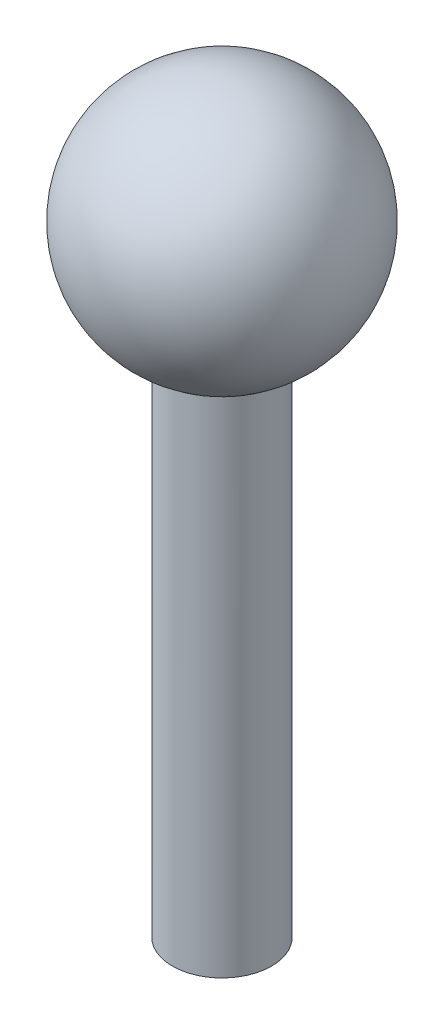
ISO-10303-21;
HEADER;
FILE_DESCRIPTION(('STEP AP214'),'2;1');
FILE_NAME('part.step','',(''),(''),'','','');
FILE_SCHEMA(('AUTOMOTIVE_DESIGN { 1 0 10303 214 1 1 1 1 }'));
ENDSEC;
DATA;
#1=APPLICATION_CONTEXT('core data for automotive mechanical design processes');
#2=APPLICATION_PROTOCOL_DEFINITION('international standard','automotive_design',2000,#1);
#3=PRODUCT_CONTEXT('',#1,'mechanical');
#4=PRODUCT('Part','Part','',(#3));
#5=PRODUCT_RELATED_PRODUCT_CATEGORY('part','',(#4));
#6=PRODUCT_DEFINITION_FORMATION('','',#4);
#7=PRODUCT_DEFINITION_CONTEXT('part definition',#1,'design');
#8=PRODUCT_DEFINITION('design','',#6,#7);
#9=PRODUCT_DEFINITION_SHAPE('','',#8);
#10=(LENGTH_UNIT() NAMED_UNIT(*) SI_UNIT(.MILLI.,.METRE.));
#11=(NAMED_UNIT(*) PLANE_ANGLE_UNIT() SI_UNIT($,.RADIAN.));
#12=(NAMED_UNIT(*) SI_UNIT($,.STERADIAN.) SOLID_ANGLE_UNIT());
#13=UNCERTAINTY_MEASURE_WITH_UNIT(LENGTH_MEASURE(1.E-05),#10,'distance_accuracy_value','');
#14=(GEOMETRIC_REPRESENTATION_CONTEXT(3) GLOBAL_UNCERTAINTY_ASSIGNED_CONTEXT((#13)) GLOBAL_UNIT_ASSIGNED_CONTEXT((#10,
#11,#12)) REPRESENTATION_CONTEXT('',''));
#15=CARTESIAN_POINT('',(0.,0.,0.));
#16=DIRECTION('',(0.,0.,1.));
#17=DIRECTION('',(1.,0.,0.));
#18=AXIS2_PLACEMENT_3D('',#15,#16,#17);
#19=CARTESIAN_POINT('',(0.,50.,0.));
#20=DIRECTION('',(0.,-1.,0.));
#21=DIRECTION('',(1.,0.,0.));
#22=AXIS2_PLACEMENT_3D('',#19,#20,#21);
#23=SPHERICAL_SURFACE('',#22,10.);
#24=CARTESIAN_POINT('',(0.,40.8348486100883,0.));
#25=DIRECTION('',(0.,-1.,0.));
#26=DIRECTION('',(0.,0.,-1.));
#27=AXIS2_PLACEMENT_3D('',#24,#25,#26);
#28=CIRCLE('',#27,4.);
#29=CARTESIAN_POINT('',(0.,40.8348486100883,-4.));
#30=VERTEX_POINT('',#29);
#31=EDGE_CURVE('E10',#30,#30,#28,.T.);
#32=ORIENTED_EDGE('',*,*,#31,.F.);
#33=EDGE_LOOP('',(#32));
#34=FACE_BOUND('',#33,.T.);
#35=ADVANCED_FACE('F45',(#34),#23,.T.);
#36=CARTESIAN_POINT('',(0.,0.,0.));
#37=DIRECTION('',(0.,-1.,0.));
#38=DIRECTION('',(0.,0.,-1.));
#39=AXIS2_PLACEMENT_3D('',#36,#37,#38);
#40=CYLINDRICAL_SURFACE('',#39,4.);
#41=CARTESIAN_POINT('',(0.,0.,0.));
#42=DIRECTION('',(0.,-1.,0.));
#43=DIRECTION('',(0.,0.,-1.));
#44=AXIS2_PLACEMENT_3D('',#41,#42,#43);
#45=CIRCLE('',#44,4.);
#46=CARTESIAN_POINT('',(0.,0.,-4.));
#47=VERTEX_POINT('',#46);
#48=EDGE_CURVE('E51',#47,#47,#45,.T.);
#49=ORIENTED_EDGE('',*,*,#48,.F.);
#50=EDGE_LOOP('',(#49));
#51=FACE_BOUND('',#50,.T.);
#52=ORIENTED_EDGE('',*,*,#31,.T.);
#53=EDGE_LOOP('',(#52));
#54=FACE_BOUND('',#53,.T.);
#55=ADVANCED_FACE('F59',(#51,#54),#40,.T.);
#56=CARTESIAN_POINT('',(0.,0.,0.));
#57=DIRECTION('',(0.,1.,0.));
#58=DIRECTION('',(0.,0.,1.));
#59=AXIS2_PLACEMENT_3D('',#56,#57,#58);
#60=PLANE('',#59);
#61=ORIENTED_EDGE('',*,*,#48,.T.);
#62=EDGE_LOOP('',(#61));
#63=FACE_BOUND('',#62,.T.);
#64=ADVANCED_FACE('F57',(#63),#60,.F.);
#65=CLOSED_SHELL('',(#35,#55,#64));
#66=MANIFOLD_SOLID_BREP('B2',#65);
#67=ADVANCED_BREP_SHAPE_REPRESENTATION('',(#18,#66),#14);
#68=SHAPE_DEFINITION_REPRESENTATION(#9,#67);
ENDSEC;
END-ISO-10303-21;
